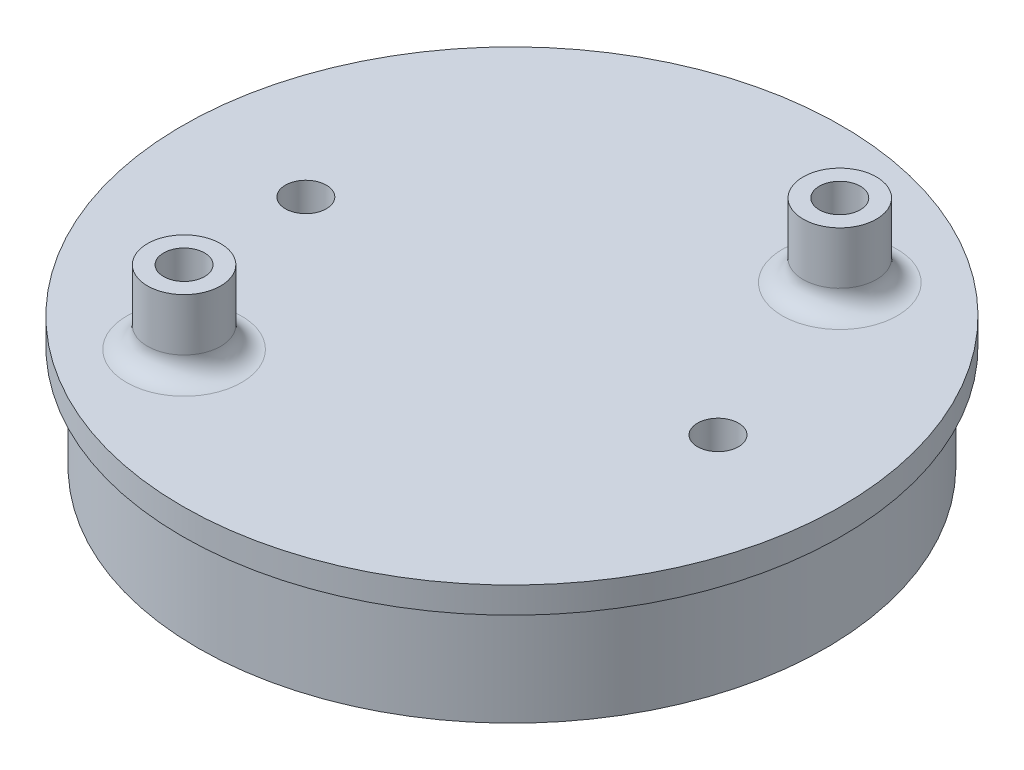
ISO-10303-21;
HEADER;
FILE_DESCRIPTION(('STEP AP214'),'2;1');
FILE_NAME('part.step','',(''),(''),'','','');
FILE_SCHEMA(('AUTOMOTIVE_DESIGN { 1 0 10303 214 1 1 1 1 }'));
ENDSEC;
DATA;
#1=APPLICATION_CONTEXT('core data for automotive mechanical design processes');
#2=APPLICATION_PROTOCOL_DEFINITION('international standard','automotive_design',2000,#1);
#3=PRODUCT_CONTEXT('',#1,'mechanical');
#4=PRODUCT('Part','Part','',(#3));
#5=PRODUCT_RELATED_PRODUCT_CATEGORY('part','',(#4));
#6=PRODUCT_DEFINITION_FORMATION('','',#4);
#7=PRODUCT_DEFINITION_CONTEXT('part definition',#1,'design');
#8=PRODUCT_DEFINITION('design','',#6,#7);
#9=PRODUCT_DEFINITION_SHAPE('','',#8);
#10=(LENGTH_UNIT() NAMED_UNIT(*) SI_UNIT(.MILLI.,.METRE.));
#11=(NAMED_UNIT(*) PLANE_ANGLE_UNIT() SI_UNIT($,.RADIAN.));
#12=(NAMED_UNIT(*) SI_UNIT($,.STERADIAN.) SOLID_ANGLE_UNIT());
#13=UNCERTAINTY_MEASURE_WITH_UNIT(LENGTH_MEASURE(1.E-05),#10,'distance_accuracy_value','');
#14=(GEOMETRIC_REPRESENTATION_CONTEXT(3) GLOBAL_UNCERTAINTY_ASSIGNED_CONTEXT((#13)) GLOBAL_UNIT_ASSIGNED_CONTEXT((#10,
#11,#12)) REPRESENTATION_CONTEXT('',''));
#15=CARTESIAN_POINT('',(0.,0.,0.));
#16=DIRECTION('',(0.,0.,1.));
#17=DIRECTION('',(1.,0.,0.));
#18=AXIS2_PLACEMENT_3D('',#15,#16,#17);
#19=CARTESIAN_POINT('',(0.,3.175,0.));
#20=DIRECTION('',(0.,1.,0.));
#21=DIRECTION('',(0.,0.,1.));
#22=AXIS2_PLACEMENT_3D('',#19,#20,#21);
#23=PLANE('',#22);
#24=CARTESIAN_POINT('',(16.3899466687312,3.175,-23.4072696655579));
#25=DIRECTION('',(0.,1.,0.));
#26=DIRECTION('',(0.,0.,1.));
#27=AXIS2_PLACEMENT_3D('',#24,#25,#26);
#28=CIRCLE('',#27,6.98499999999999);
#29=CARTESIAN_POINT('',(16.3899466687312,3.175,-16.4222696655579));
#30=VERTEX_POINT('',#29);
#31=EDGE_CURVE('E63',#30,#30,#28,.F.);
#32=ORIENTED_EDGE('',*,*,#31,.T.);
#33=EDGE_LOOP('',(#32));
#34=FACE_BOUND('',#33,.T.);
#35=CARTESIAN_POINT('',(-16.3899466687312,3.175,23.4072696655579));
#36=DIRECTION('',(0.,1.,0.));
#37=DIRECTION('',(0.,0.,1.));
#38=AXIS2_PLACEMENT_3D('',#35,#36,#37);
#39=CIRCLE('',#38,6.98499999999996);
#40=CARTESIAN_POINT('',(-16.3899466687312,3.175,30.3922696655579));
#41=VERTEX_POINT('',#40);
#42=EDGE_CURVE('E67',#41,#41,#39,.F.);
#43=ORIENTED_EDGE('',*,*,#42,.T.);
#44=EDGE_LOOP('',(#43));
#45=FACE_BOUND('',#44,.T.);
#46=CARTESIAN_POINT('',(0.,3.175,0.));
#47=DIRECTION('',(0.,1.,0.));
#48=DIRECTION('',(0.,0.,1.));
#49=AXIS2_PLACEMENT_3D('',#46,#47,#48);
#50=CIRCLE('',#49,40.005);
#51=CARTESIAN_POINT('',(0.,3.175,40.005));
#52=VERTEX_POINT('',#51);
#53=EDGE_CURVE('E76',#52,#52,#50,.T.);
#54=ORIENTED_EDGE('',*,*,#53,.T.);
#55=EDGE_LOOP('',(#54));
#56=FACE_BOUND('',#55,.T.);
#57=CARTESIAN_POINT('',(25.015,3.175,0.));
#58=DIRECTION('',(0.,1.,0.));
#59=DIRECTION('',(0.,0.,1.));
#60=AXIS2_PLACEMENT_3D('',#57,#58,#59);
#61=CIRCLE('',#60,2.4892);
#62=CARTESIAN_POINT('',(25.015,3.175,2.48919999999999));
#63=VERTEX_POINT('',#62);
#64=EDGE_CURVE('E91',#63,#63,#61,.T.);
#65=ORIENTED_EDGE('',*,*,#64,.F.);
#66=EDGE_LOOP('',(#65));
#67=FACE_BOUND('',#66,.T.);
#68=CARTESIAN_POINT('',(-25.015,3.175,0.));
#69=DIRECTION('',(0.,1.,0.));
#70=DIRECTION('',(0.,0.,1.));
#71=AXIS2_PLACEMENT_3D('',#68,#69,#70);
#72=CIRCLE('',#71,2.4892);
#73=CARTESIAN_POINT('',(-25.015,3.175,2.4892));
#74=VERTEX_POINT('',#73);
#75=EDGE_CURVE('E86',#74,#74,#72,.T.);
#76=ORIENTED_EDGE('',*,*,#75,.F.);
#77=EDGE_LOOP('',(#76));
#78=FACE_BOUND('',#77,.T.);
#79=ADVANCED_FACE('F56',(#34,#45,#56,#67,#78),#23,.T.);
#80=CARTESIAN_POINT('',(0.,-12.7,0.));
#81=DIRECTION('',(0.,1.,0.));
#82=DIRECTION('',(0.,0.,1.));
#83=AXIS2_PLACEMENT_3D('',#80,#81,#82);
#84=PLANE('',#83);
#85=CARTESIAN_POINT('',(16.3899466687312,-12.7,-23.4072696655579));
#86=DIRECTION('',(0.,1.,0.));
#87=DIRECTION('',(0.,0.,1.));
#88=AXIS2_PLACEMENT_3D('',#85,#86,#87);
#89=CIRCLE('',#88,2.4892);
#90=CARTESIAN_POINT('',(16.3899466687312,-12.7,-20.9180696655579));
#91=VERTEX_POINT('',#90);
#92=EDGE_CURVE('E101',#91,#91,#89,.T.);
#93=ORIENTED_EDGE('',*,*,#92,.T.);
#94=EDGE_LOOP('',(#93));
#95=FACE_BOUND('',#94,.T.);
#96=CARTESIAN_POINT('',(-25.015,-12.7,0.));
#97=DIRECTION('',(0.,1.,0.));
#98=DIRECTION('',(0.,0.,1.));
#99=AXIS2_PLACEMENT_3D('',#96,#97,#98);
#100=CIRCLE('',#99,2.4892);
#101=CARTESIAN_POINT('',(-25.015,-12.7,2.4892));
#102=VERTEX_POINT('',#101);
#103=EDGE_CURVE('E94',#102,#102,#100,.T.);
#104=ORIENTED_EDGE('',*,*,#103,.T.);
#105=EDGE_LOOP('',(#104));
#106=FACE_BOUND('',#105,.T.);
#107=CARTESIAN_POINT('',(25.015,-12.7,0.));
#108=DIRECTION('',(0.,1.,0.));
#109=DIRECTION('',(0.,0.,-1.));
#110=AXIS2_PLACEMENT_3D('',#107,#108,#109);
#111=CIRCLE('',#110,2.4892);
#112=CARTESIAN_POINT('',(25.015,-12.7,-2.48920000000001));
#113=VERTEX_POINT('',#112);
#114=EDGE_CURVE('E95',#113,#113,#111,.T.);
#115=ORIENTED_EDGE('',*,*,#114,.T.);
#116=EDGE_LOOP('',(#115));
#117=FACE_BOUND('',#116,.T.);
#118=CARTESIAN_POINT('',(0.,-12.7,0.));
#119=DIRECTION('',(0.,1.,0.));
#120=DIRECTION('',(0.,0.,1.));
#121=AXIS2_PLACEMENT_3D('',#118,#119,#120);
#122=CIRCLE('',#121,38.1);
#123=CARTESIAN_POINT('',(0.,-12.7,38.1));
#124=VERTEX_POINT('',#123);
#125=EDGE_CURVE('E80',#124,#124,#122,.T.);
#126=ORIENTED_EDGE('',*,*,#125,.F.);
#127=EDGE_LOOP('',(#126));
#128=FACE_BOUND('',#127,.T.);
#129=CARTESIAN_POINT('',(-16.3899466687312,-12.7,23.4072696655579));
#130=DIRECTION('',(0.,1.,0.));
#131=DIRECTION('',(0.,0.,1.));
#132=AXIS2_PLACEMENT_3D('',#129,#130,#131);
#133=CIRCLE('',#132,2.48919999999997);
#134=CARTESIAN_POINT('',(-16.3899466687312,-12.7,25.8964696655579));
#135=VERTEX_POINT('',#134);
#136=EDGE_CURVE('E98',#135,#135,#133,.F.);
#137=ORIENTED_EDGE('',*,*,#136,.F.);
#138=EDGE_LOOP('',(#137));
#139=FACE_BOUND('',#138,.T.);
#140=ADVANCED_FACE('F138',(#95,#106,#117,#128,#139),#84,.F.);
#141=CARTESIAN_POINT('',(0.,0.,0.));
#142=DIRECTION('',(0.,1.,0.));
#143=DIRECTION('',(0.,0.,1.));
#144=AXIS2_PLACEMENT_3D('',#141,#142,#143);
#145=PLANE('',#144);
#146=CARTESIAN_POINT('',(0.,0.,0.));
#147=DIRECTION('',(0.,1.,0.));
#148=DIRECTION('',(0.,0.,1.));
#149=AXIS2_PLACEMENT_3D('',#146,#147,#148);
#150=CIRCLE('',#149,38.1);
#151=CARTESIAN_POINT('',(0.,0.,38.1));
#152=VERTEX_POINT('',#151);
#153=EDGE_CURVE('E83',#152,#152,#150,.T.);
#154=ORIENTED_EDGE('',*,*,#153,.T.);
#155=EDGE_LOOP('',(#154));
#156=FACE_BOUND('',#155,.T.);
#157=CARTESIAN_POINT('',(0.,0.,0.));
#158=DIRECTION('',(0.,1.,0.));
#159=DIRECTION('',(0.,0.,1.));
#160=AXIS2_PLACEMENT_3D('',#157,#158,#159);
#161=CIRCLE('',#160,40.005);
#162=CARTESIAN_POINT('',(0.,0.,40.005));
#163=VERTEX_POINT('',#162);
#164=EDGE_CURVE('E77',#163,#163,#161,.T.);
#165=ORIENTED_EDGE('',*,*,#164,.F.);
#166=EDGE_LOOP('',(#165));
#167=FACE_BOUND('',#166,.T.);
#168=ADVANCED_FACE('F143',(#156,#167),#145,.F.);
#169=CARTESIAN_POINT('',(0.,3.175,0.));
#170=DIRECTION('',(0.,-1.,0.));
#171=DIRECTION('',(0.,0.,-1.));
#172=AXIS2_PLACEMENT_3D('',#169,#170,#171);
#173=CYLINDRICAL_SURFACE('',#172,40.005);
#174=ORIENTED_EDGE('',*,*,#53,.F.);
#175=EDGE_LOOP('',(#174));
#176=FACE_BOUND('',#175,.T.);
#177=ORIENTED_EDGE('',*,*,#164,.T.);
#178=EDGE_LOOP('',(#177));
#179=FACE_BOUND('',#178,.T.);
#180=ADVANCED_FACE('F146',(#176,#179),#173,.T.);
#181=CARTESIAN_POINT('',(0.,-12.7,0.));
#182=DIRECTION('',(0.,1.,0.));
#183=DIRECTION('',(0.,0.,1.));
#184=AXIS2_PLACEMENT_3D('',#181,#182,#183);
#185=CYLINDRICAL_SURFACE('',#184,38.1);
#186=ORIENTED_EDGE('',*,*,#125,.T.);
#187=EDGE_LOOP('',(#186));
#188=FACE_BOUND('',#187,.T.);
#189=ORIENTED_EDGE('',*,*,#153,.F.);
#190=EDGE_LOOP('',(#189));
#191=FACE_BOUND('',#190,.T.);
#192=ADVANCED_FACE('F150',(#188,#191),#185,.T.);
#193=CARTESIAN_POINT('',(25.015,-12.7,0.));
#194=DIRECTION('',(0.,1.,0.));
#195=DIRECTION('',(0.,0.,1.));
#196=AXIS2_PLACEMENT_3D('',#193,#194,#195);
#197=CYLINDRICAL_SURFACE('',#196,2.4892);
#198=ORIENTED_EDGE('',*,*,#64,.T.);
#199=EDGE_LOOP('',(#198));
#200=FACE_BOUND('',#199,.T.);
#201=ORIENTED_EDGE('',*,*,#114,.F.);
#202=EDGE_LOOP('',(#201));
#203=FACE_BOUND('',#202,.T.);
#204=ADVANCED_FACE('F180',(#200,#203),#197,.F.);
#205=CARTESIAN_POINT('',(-25.015,-12.7,0.));
#206=DIRECTION('',(0.,1.,0.));
#207=DIRECTION('',(0.,0.,1.));
#208=AXIS2_PLACEMENT_3D('',#205,#206,#207);
#209=CYLINDRICAL_SURFACE('',#208,2.4892);
#210=ORIENTED_EDGE('',*,*,#75,.T.);
#211=EDGE_LOOP('',(#210));
#212=FACE_BOUND('',#211,.T.);
#213=ORIENTED_EDGE('',*,*,#103,.F.);
#214=EDGE_LOOP('',(#213));
#215=FACE_BOUND('',#214,.T.);
#216=ADVANCED_FACE('F177',(#212,#215),#209,.F.);
#217=CARTESIAN_POINT('',(16.3899466687312,-12.7,-23.4072696655579));
#218=DIRECTION('',(0.,1.,0.));
#219=DIRECTION('',(0.,0.,1.));
#220=AXIS2_PLACEMENT_3D('',#217,#218,#219);
#221=CYLINDRICAL_SURFACE('',#220,2.4892);
#222=ORIENTED_EDGE('',*,*,#92,.F.);
#223=EDGE_LOOP('',(#222));
#224=FACE_BOUND('',#223,.T.);
#225=CARTESIAN_POINT('',(16.3899466687312,12.065,-23.4072696655579));
#226=DIRECTION('',(0.,1.,0.));
#227=DIRECTION('',(0.,0.,1.));
#228=AXIS2_PLACEMENT_3D('',#225,#226,#227);
#229=CIRCLE('',#228,2.4892);
#230=CARTESIAN_POINT('',(16.3899466687312,12.065,-20.9180696655579));
#231=VERTEX_POINT('',#230);
#232=EDGE_CURVE('E110',#231,#231,#229,.T.);
#233=ORIENTED_EDGE('',*,*,#232,.T.);
#234=EDGE_LOOP('',(#233));
#235=FACE_BOUND('',#234,.T.);
#236=ADVANCED_FACE('F119',(#224,#235),#221,.F.);
#237=CARTESIAN_POINT('',(-16.3899466687312,-12.7,23.4072696655579));
#238=DIRECTION('',(0.,1.,0.));
#239=DIRECTION('',(0.,0.,1.));
#240=AXIS2_PLACEMENT_3D('',#237,#238,#239);
#241=CYLINDRICAL_SURFACE('',#240,2.48919999999997);
#242=ORIENTED_EDGE('',*,*,#136,.T.);
#243=EDGE_LOOP('',(#242));
#244=FACE_BOUND('',#243,.T.);
#245=CARTESIAN_POINT('',(-16.3899466687312,12.065,23.4072696655579));
#246=DIRECTION('',(0.,1.,0.));
#247=DIRECTION('',(0.,0.,-1.));
#248=AXIS2_PLACEMENT_3D('',#245,#246,#247);
#249=CIRCLE('',#248,2.48919999999997);
#250=CARTESIAN_POINT('',(-16.3899466687312,12.065,20.918069665558));
#251=VERTEX_POINT('',#250);
#252=EDGE_CURVE('E111',#251,#251,#249,.T.);
#253=ORIENTED_EDGE('',*,*,#252,.T.);
#254=EDGE_LOOP('',(#253));
#255=FACE_BOUND('',#254,.T.);
#256=ADVANCED_FACE('F191',(#244,#255),#241,.F.);
#257=CARTESIAN_POINT('',(-16.3899466687312,12.065,23.4072696655579));
#258=DIRECTION('',(0.,-1.,0.));
#259=DIRECTION('',(0.,0.,-1.));
#260=AXIS2_PLACEMENT_3D('',#257,#258,#259);
#261=PLANE('',#260);
#262=CARTESIAN_POINT('',(-16.3899466687312,12.065,23.4072696655579));
#263=DIRECTION('',(0.,1.,0.));
#264=DIRECTION('',(0.,0.,-1.));
#265=AXIS2_PLACEMENT_3D('',#262,#263,#264);
#266=CIRCLE('',#265,4.44499999999996);
#267=CARTESIAN_POINT('',(-16.3899466687312,12.065,18.962269665558));
#268=VERTEX_POINT('',#267);
#269=EDGE_CURVE('E107',#268,#268,#266,.T.);
#270=ORIENTED_EDGE('',*,*,#269,.T.);
#271=EDGE_LOOP('',(#270));
#272=FACE_BOUND('',#271,.T.);
#273=ORIENTED_EDGE('',*,*,#252,.F.);
#274=EDGE_LOOP('',(#273));
#275=FACE_BOUND('',#274,.T.);
#276=ADVANCED_FACE('F136',(#272,#275),#261,.F.);
#277=CARTESIAN_POINT('',(-16.3899466687312,12.065,23.4072696655579));
#278=DIRECTION('',(0.,-1.,0.));
#279=DIRECTION('',(0.,0.,-1.));
#280=AXIS2_PLACEMENT_3D('',#277,#278,#279);
#281=CYLINDRICAL_SURFACE('',#280,4.44499999999996);
#282=CARTESIAN_POINT('',(-16.3899466687312,5.715,23.4072696655579));
#283=DIRECTION('',(0.,1.,0.));
#284=DIRECTION('',(0.,0.,1.));
#285=AXIS2_PLACEMENT_3D('',#282,#283,#284);
#286=CIRCLE('',#285,4.44499999999996);
#287=CARTESIAN_POINT('',(-16.3899466687312,5.715,27.8522696655579));
#288=VERTEX_POINT('',#287);
#289=EDGE_CURVE('E11',#288,#288,#286,.T.);
#290=ORIENTED_EDGE('',*,*,#289,.T.);
#291=EDGE_LOOP('',(#290));
#292=FACE_BOUND('',#291,.T.);
#293=ORIENTED_EDGE('',*,*,#269,.F.);
#294=EDGE_LOOP('',(#293));
#295=FACE_BOUND('',#294,.T.);
#296=ADVANCED_FACE('F124',(#292,#295),#281,.T.);
#297=CARTESIAN_POINT('',(16.3899466687312,12.065,-23.4072696655579));
#298=DIRECTION('',(0.,1.,0.));
#299=DIRECTION('',(0.,0.,1.));
#300=AXIS2_PLACEMENT_3D('',#297,#298,#299);
#301=PLANE('',#300);
#302=CARTESIAN_POINT('',(16.3899466687312,12.065,-23.4072696655579));
#303=DIRECTION('',(0.,1.,0.));
#304=DIRECTION('',(0.,0.,1.));
#305=AXIS2_PLACEMENT_3D('',#302,#303,#304);
#306=CIRCLE('',#305,4.44499999999999);
#307=CARTESIAN_POINT('',(16.3899466687312,12.065,-18.962269665558));
#308=VERTEX_POINT('',#307);
#309=EDGE_CURVE('E104',#308,#308,#306,.T.);
#310=ORIENTED_EDGE('',*,*,#309,.T.);
#311=EDGE_LOOP('',(#310));
#312=FACE_BOUND('',#311,.T.);
#313=ORIENTED_EDGE('',*,*,#232,.F.);
#314=EDGE_LOOP('',(#313));
#315=FACE_BOUND('',#314,.T.);
#316=ADVANCED_FACE('F121',(#312,#315),#301,.T.);
#317=CARTESIAN_POINT('',(16.3899466687312,12.065,-23.4072696655579));
#318=DIRECTION('',(0.,-1.,0.));
#319=DIRECTION('',(0.,0.,-1.));
#320=AXIS2_PLACEMENT_3D('',#317,#318,#319);
#321=CYLINDRICAL_SURFACE('',#320,4.44499999999999);
#322=CARTESIAN_POINT('',(16.3899466687312,5.715,-23.4072696655579));
#323=DIRECTION('',(0.,1.,0.));
#324=DIRECTION('',(0.,0.,1.));
#325=AXIS2_PLACEMENT_3D('',#322,#323,#324);
#326=CIRCLE('',#325,4.44499999999999);
#327=CARTESIAN_POINT('',(16.3899466687312,5.715,-18.962269665558));
#328=VERTEX_POINT('',#327);
#329=EDGE_CURVE('E71',#328,#328,#326,.T.);
#330=ORIENTED_EDGE('',*,*,#329,.T.);
#331=EDGE_LOOP('',(#330));
#332=FACE_BOUND('',#331,.T.);
#333=ORIENTED_EDGE('',*,*,#309,.F.);
#334=EDGE_LOOP('',(#333));
#335=FACE_BOUND('',#334,.T.);
#336=ADVANCED_FACE('F123',(#332,#335),#321,.T.);
#337=CARTESIAN_POINT('',(16.3899466687312,5.715,-23.4072696655579));
#338=DIRECTION('',(0.,1.,0.));
#339=DIRECTION('',(0.,0.,1.));
#340=AXIS2_PLACEMENT_3D('',#337,#338,#339);
#341=TOROIDAL_SURFACE('',#340,6.98499999999999,2.54);
#342=ORIENTED_EDGE('',*,*,#31,.F.);
#343=EDGE_LOOP('',(#342));
#344=FACE_BOUND('',#343,.T.);
#345=ORIENTED_EDGE('',*,*,#329,.F.);
#346=EDGE_LOOP('',(#345));
#347=FACE_BOUND('',#346,.T.);
#348=ADVANCED_FACE('F132',(#344,#347),#341,.F.);
#349=CARTESIAN_POINT('',(-16.3899466687312,5.715,23.4072696655579));
#350=DIRECTION('',(0.,1.,0.));
#351=DIRECTION('',(0.,0.,1.));
#352=AXIS2_PLACEMENT_3D('',#349,#350,#351);
#353=TOROIDAL_SURFACE('',#352,6.98499999999996,2.54);
#354=ORIENTED_EDGE('',*,*,#42,.F.);
#355=EDGE_LOOP('',(#354));
#356=FACE_BOUND('',#355,.T.);
#357=ORIENTED_EDGE('',*,*,#289,.F.);
#358=EDGE_LOOP('',(#357));
#359=FACE_BOUND('',#358,.T.);
#360=ADVANCED_FACE('F58',(#356,#359),#353,.F.);
#361=CLOSED_SHELL('',(#79,#140,#168,#180,#192,#204,#216,#236,#256,#276,#296,#316,#336,#348,#360));
#362=MANIFOLD_SOLID_BREP('B2',#361);
#363=ADVANCED_BREP_SHAPE_REPRESENTATION('',(#18,#362),#14);
#364=SHAPE_DEFINITION_REPRESENTATION(#9,#363);
ENDSEC;
END-ISO-10303-21;
